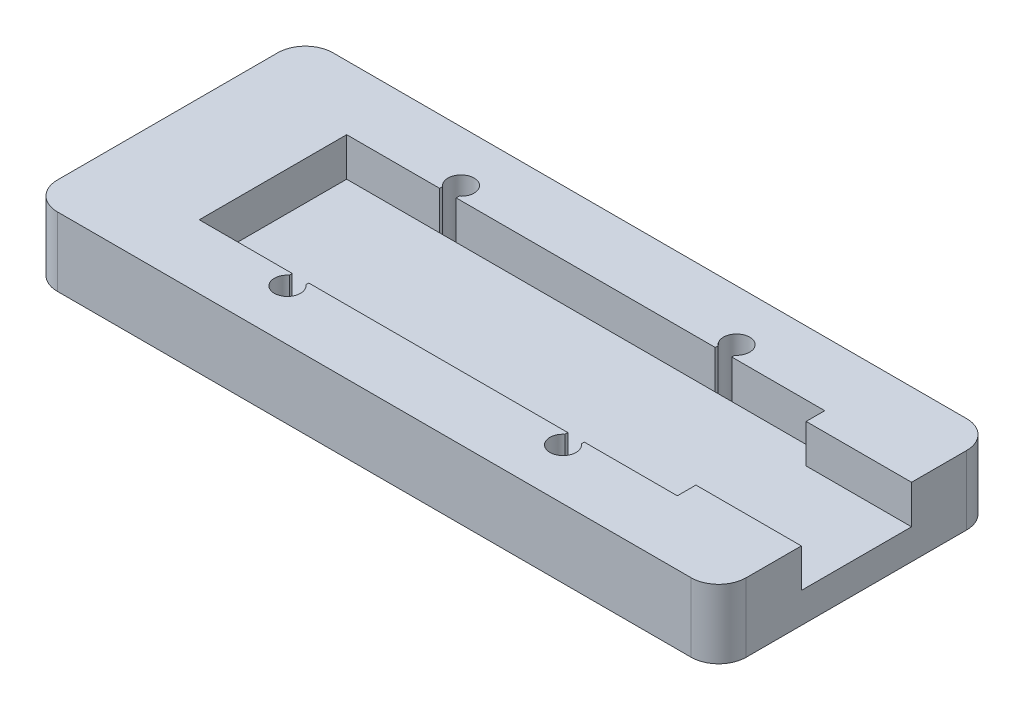
ISO-10303-21;
HEADER;
FILE_DESCRIPTION(('STEP AP214'),'2;1');
FILE_NAME('part.step','',(''),(''),'','','');
FILE_SCHEMA(('AUTOMOTIVE_DESIGN { 1 0 10303 214 1 1 1 1 }'));
ENDSEC;
DATA;
#1=APPLICATION_CONTEXT('core data for automotive mechanical design processes');
#2=APPLICATION_PROTOCOL_DEFINITION('international standard','automotive_design',2000,#1);
#3=PRODUCT_CONTEXT('',#1,'mechanical');
#4=PRODUCT('Part','Part','',(#3));
#5=PRODUCT_RELATED_PRODUCT_CATEGORY('part','',(#4));
#6=PRODUCT_DEFINITION_FORMATION('','',#4);
#7=PRODUCT_DEFINITION_CONTEXT('part definition',#1,'design');
#8=PRODUCT_DEFINITION('design','',#6,#7);
#9=PRODUCT_DEFINITION_SHAPE('','',#8);
#10=(LENGTH_UNIT() NAMED_UNIT(*) SI_UNIT(.MILLI.,.METRE.));
#11=(NAMED_UNIT(*) PLANE_ANGLE_UNIT() SI_UNIT($,.RADIAN.));
#12=(NAMED_UNIT(*) SI_UNIT($,.STERADIAN.) SOLID_ANGLE_UNIT());
#13=UNCERTAINTY_MEASURE_WITH_UNIT(LENGTH_MEASURE(1.E-05),#10,'distance_accuracy_value','');
#14=(GEOMETRIC_REPRESENTATION_CONTEXT(3) GLOBAL_UNCERTAINTY_ASSIGNED_CONTEXT((#13)) GLOBAL_UNIT_ASSIGNED_CONTEXT((#10,
#11,#12)) REPRESENTATION_CONTEXT('',''));
#15=CARTESIAN_POINT('',(0.,0.,0.));
#16=DIRECTION('',(0.,0.,1.));
#17=DIRECTION('',(1.,0.,0.));
#18=AXIS2_PLACEMENT_3D('',#15,#16,#17);
#19=CARTESIAN_POINT('',(-17.35,2.2,-5.35));
#20=DIRECTION('',(0.,0.,-1.));
#21=DIRECTION('',(-1.,0.,0.));
#22=AXIS2_PLACEMENT_3D('',#19,#20,#21);
#23=PLANE('',#22);
#24=DIRECTION('',(-1.,0.,0.));
#25=VECTOR('',#24,1.);
#26=CARTESIAN_POINT('',(-17.35,5.,-5.35));
#27=LINE('',#26,#25);
#28=CARTESIAN_POINT('',(17.35,5.,-5.35));
#29=VERTEX_POINT('',#28);
#30=CARTESIAN_POINT('',(10.6,5.,-5.35));
#31=VERTEX_POINT('',#30);
#32=EDGE_CURVE('E430',#29,#31,#27,.T.);
#33=ORIENTED_EDGE('',*,*,#32,.T.);
#34=DIRECTION('',(0.,1.,0.));
#35=VECTOR('',#34,1.);
#36=CARTESIAN_POINT('',(10.6,0.,-5.35));
#37=LINE('',#36,#35);
#38=CARTESIAN_POINT('',(10.6,2.2,-5.35));
#39=VERTEX_POINT('',#38);
#40=EDGE_CURVE('E331',#39,#31,#37,.T.);
#41=ORIENTED_EDGE('',*,*,#40,.F.);
#42=DIRECTION('',(-1.,0.,0.));
#43=VECTOR('',#42,1.);
#44=CARTESIAN_POINT('',(-17.35,2.2,-5.35));
#45=LINE('',#44,#43);
#46=CARTESIAN_POINT('',(17.35,2.2,-5.35));
#47=VERTEX_POINT('',#46);
#48=EDGE_CURVE('E402',#47,#39,#45,.T.);
#49=ORIENTED_EDGE('',*,*,#48,.F.);
#50=DIRECTION('',(0.,1.,0.));
#51=VECTOR('',#50,1.);
#52=CARTESIAN_POINT('',(17.35,2.2,-5.35));
#53=LINE('',#52,#51);
#54=EDGE_CURVE('E427',#47,#29,#53,.T.);
#55=ORIENTED_EDGE('',*,*,#54,.T.);
#56=EDGE_LOOP('',(#33,#41,#49,#55));
#57=FACE_BOUND('',#56,.T.);
#58=ADVANCED_FACE('F33',(#57),#23,.F.);
#59=CARTESIAN_POINT('',(-17.35,2.2,5.35));
#60=DIRECTION('',(0.,0.,1.));
#61=DIRECTION('',(1.,0.,0.));
#62=AXIS2_PLACEMENT_3D('',#59,#60,#61);
#63=PLANE('',#62);
#64=DIRECTION('',(1.,0.,0.));
#65=VECTOR('',#64,1.);
#66=CARTESIAN_POINT('',(-17.35,5.,5.35));
#67=LINE('',#66,#65);
#68=CARTESIAN_POINT('',(-17.35,5.,5.35));
#69=VERTEX_POINT('',#68);
#70=CARTESIAN_POINT('',(-10.6,5.,5.35));
#71=VERTEX_POINT('',#70);
#72=EDGE_CURVE('E438',#69,#71,#67,.T.);
#73=ORIENTED_EDGE('',*,*,#72,.T.);
#74=DIRECTION('',(0.,1.,0.));
#75=VECTOR('',#74,1.);
#76=CARTESIAN_POINT('',(-10.6,0.,5.35));
#77=LINE('',#76,#75);
#78=CARTESIAN_POINT('',(-10.6,2.2,5.35));
#79=VERTEX_POINT('',#78);
#80=EDGE_CURVE('E302',#79,#71,#77,.T.);
#81=ORIENTED_EDGE('',*,*,#80,.F.);
#82=DIRECTION('',(1.,0.,0.));
#83=VECTOR('',#82,1.);
#84=CARTESIAN_POINT('',(-17.35,2.2,5.35));
#85=LINE('',#84,#83);
#86=CARTESIAN_POINT('',(-17.35,2.2,5.35));
#87=VERTEX_POINT('',#86);
#88=EDGE_CURVE('E412',#87,#79,#85,.T.);
#89=ORIENTED_EDGE('',*,*,#88,.F.);
#90=DIRECTION('',(0.,1.,0.));
#91=VECTOR('',#90,1.);
#92=CARTESIAN_POINT('',(-17.35,2.2,5.35));
#93=LINE('',#92,#91);
#94=EDGE_CURVE('E462',#87,#69,#93,.T.);
#95=ORIENTED_EDGE('',*,*,#94,.T.);
#96=EDGE_LOOP('',(#73,#81,#89,#95));
#97=FACE_BOUND('',#96,.T.);
#98=ADVANCED_FACE('F572',(#97),#63,.F.);
#99=CARTESIAN_POINT('',(-9.4,2.2,5.35));
#100=VERTEX_POINT('',#99);
#101=CARTESIAN_POINT('',(9.4,2.2,5.35));
#102=VERTEX_POINT('',#101);
#103=EDGE_CURVE('E689',#100,#102,#85,.T.);
#104=ORIENTED_EDGE('',*,*,#103,.F.);
#105=DIRECTION('',(0.,1.,0.));
#106=VECTOR('',#105,1.);
#107=CARTESIAN_POINT('',(-9.4,0.,5.35));
#108=LINE('',#107,#106);
#109=CARTESIAN_POINT('',(-9.4,5.,5.35));
#110=VERTEX_POINT('',#109);
#111=EDGE_CURVE('E305',#100,#110,#108,.T.);
#112=ORIENTED_EDGE('',*,*,#111,.T.);
#113=CARTESIAN_POINT('',(9.4,5.,5.35));
#114=VERTEX_POINT('',#113);
#115=EDGE_CURVE('E442',#110,#114,#67,.T.);
#116=ORIENTED_EDGE('',*,*,#115,.T.);
#117=DIRECTION('',(0.,1.,0.));
#118=VECTOR('',#117,1.);
#119=CARTESIAN_POINT('',(9.4,0.,5.35));
#120=LINE('',#119,#118);
#121=EDGE_CURVE('E361',#102,#114,#120,.T.);
#122=ORIENTED_EDGE('',*,*,#121,.F.);
#123=EDGE_LOOP('',(#104,#112,#116,#122));
#124=FACE_BOUND('',#123,.T.);
#125=ADVANCED_FACE('F580',(#124),#63,.F.);
#126=CARTESIAN_POINT('',(9.4,2.2,-5.35));
#127=VERTEX_POINT('',#126);
#128=CARTESIAN_POINT('',(-9.4,2.2,-5.35));
#129=VERTEX_POINT('',#128);
#130=EDGE_CURVE('E407',#127,#129,#45,.T.);
#131=ORIENTED_EDGE('',*,*,#130,.F.);
#132=DIRECTION('',(0.,1.,0.));
#133=VECTOR('',#132,1.);
#134=CARTESIAN_POINT('',(9.4,0.,-5.35));
#135=LINE('',#134,#133);
#136=CARTESIAN_POINT('',(9.4,5.,-5.35));
#137=VERTEX_POINT('',#136);
#138=EDGE_CURVE('E334',#127,#137,#135,.T.);
#139=ORIENTED_EDGE('',*,*,#138,.T.);
#140=CARTESIAN_POINT('',(-9.4,5.,-5.35));
#141=VERTEX_POINT('',#140);
#142=EDGE_CURVE('E434',#137,#141,#27,.T.);
#143=ORIENTED_EDGE('',*,*,#142,.T.);
#144=DIRECTION('',(0.,1.,0.));
#145=VECTOR('',#144,1.);
#146=CARTESIAN_POINT('',(-9.4,0.,-5.35));
#147=LINE('',#146,#145);
#148=EDGE_CURVE('E392',#129,#141,#147,.T.);
#149=ORIENTED_EDGE('',*,*,#148,.F.);
#150=EDGE_LOOP('',(#131,#139,#143,#149));
#151=FACE_BOUND('',#150,.T.);
#152=ADVANCED_FACE('F575',(#151),#23,.F.);
#153=CARTESIAN_POINT('',(23.,5.,-8.));
#154=DIRECTION('',(0.,-1.,0.));
#155=DIRECTION('',(0.,0.,-1.));
#156=AXIS2_PLACEMENT_3D('',#153,#154,#155);
#157=CYLINDRICAL_SURFACE('',#156,2.);
#158=CARTESIAN_POINT('',(23.,0.,-8.));
#159=DIRECTION('',(0.,1.,0.));
#160=DIRECTION('',(0.,0.,-1.));
#161=AXIS2_PLACEMENT_3D('',#158,#159,#160);
#162=CIRCLE('',#161,2.);
#163=CARTESIAN_POINT('',(25.,0.,-7.99999999999999));
#164=VERTEX_POINT('',#163);
#165=CARTESIAN_POINT('',(23.,0.,-10.));
#166=VERTEX_POINT('',#165);
#167=EDGE_CURVE('E451',#164,#166,#162,.T.);
#168=ORIENTED_EDGE('',*,*,#167,.T.);
#169=DIRECTION('',(0.,-1.,0.));
#170=VECTOR('',#169,1.);
#171=CARTESIAN_POINT('',(23.,5.,-10.));
#172=LINE('',#171,#170);
#173=CARTESIAN_POINT('',(23.,5.,-10.));
#174=VERTEX_POINT('',#173);
#175=EDGE_CURVE('E11',#174,#166,#172,.T.);
#176=ORIENTED_EDGE('',*,*,#175,.F.);
#177=CARTESIAN_POINT('',(23.,5.,-8.));
#178=DIRECTION('',(0.,1.,0.));
#179=DIRECTION('',(0.,0.,-1.));
#180=AXIS2_PLACEMENT_3D('',#177,#178,#179);
#181=CIRCLE('',#180,2.);
#182=CARTESIAN_POINT('',(25.,5.,-7.99999999999999));
#183=VERTEX_POINT('',#182);
#184=EDGE_CURVE('E469',#183,#174,#181,.T.);
#185=ORIENTED_EDGE('',*,*,#184,.F.);
#186=DIRECTION('',(0.,-1.,0.));
#187=VECTOR('',#186,1.);
#188=CARTESIAN_POINT('',(25.,5.,-7.99999999999999));
#189=LINE('',#188,#187);
#190=EDGE_CURVE('E489',#183,#164,#189,.T.);
#191=ORIENTED_EDGE('',*,*,#190,.T.);
#192=EDGE_LOOP('',(#168,#176,#185,#191));
#193=FACE_BOUND('',#192,.T.);
#194=ADVANCED_FACE('F35',(#193),#157,.T.);
#195=CARTESIAN_POINT('',(-23.,5.,-10.));
#196=DIRECTION('',(0.,0.,1.));
#197=DIRECTION('',(1.,0.,0.));
#198=AXIS2_PLACEMENT_3D('',#195,#196,#197);
#199=PLANE('',#198);
#200=DIRECTION('',(-1.,0.,0.));
#201=VECTOR('',#200,1.);
#202=CARTESIAN_POINT('',(-23.,0.,-10.));
#203=LINE('',#202,#201);
#204=CARTESIAN_POINT('',(-23.,0.,-10.));
#205=VERTEX_POINT('',#204);
#206=EDGE_CURVE('E492',#166,#205,#203,.T.);
#207=ORIENTED_EDGE('',*,*,#206,.T.);
#208=DIRECTION('',(0.,-1.,0.));
#209=VECTOR('',#208,1.);
#210=CARTESIAN_POINT('',(-23.,5.,-10.));
#211=LINE('',#210,#209);
#212=CARTESIAN_POINT('',(-23.,5.,-10.));
#213=VERTEX_POINT('',#212);
#214=EDGE_CURVE('E41',#213,#205,#211,.T.);
#215=ORIENTED_EDGE('',*,*,#214,.F.);
#216=DIRECTION('',(-1.,0.,0.));
#217=VECTOR('',#216,1.);
#218=CARTESIAN_POINT('',(-23.,5.,-10.));
#219=LINE('',#218,#217);
#220=EDGE_CURVE('E472',#174,#213,#219,.T.);
#221=ORIENTED_EDGE('',*,*,#220,.F.);
#222=ORIENTED_EDGE('',*,*,#175,.T.);
#223=EDGE_LOOP('',(#207,#215,#221,#222));
#224=FACE_BOUND('',#223,.T.);
#225=ADVANCED_FACE('F548',(#224),#199,.F.);
#226=CARTESIAN_POINT('',(-23.,5.,-8.));
#227=DIRECTION('',(0.,-1.,0.));
#228=DIRECTION('',(0.,0.,-1.));
#229=AXIS2_PLACEMENT_3D('',#226,#227,#228);
#230=CYLINDRICAL_SURFACE('',#229,2.);
#231=CARTESIAN_POINT('',(-23.,0.,-8.));
#232=DIRECTION('',(0.,1.,0.));
#233=DIRECTION('',(0.,0.,-1.));
#234=AXIS2_PLACEMENT_3D('',#231,#232,#233);
#235=CIRCLE('',#234,2.);
#236=CARTESIAN_POINT('',(-25.,0.,-7.99999999999999));
#237=VERTEX_POINT('',#236);
#238=EDGE_CURVE('E494',#205,#237,#235,.T.);
#239=ORIENTED_EDGE('',*,*,#238,.T.);
#240=DIRECTION('',(0.,-1.,0.));
#241=VECTOR('',#240,1.);
#242=CARTESIAN_POINT('',(-25.,5.,-7.99999999999999));
#243=LINE('',#242,#241);
#244=CARTESIAN_POINT('',(-25.,5.,-7.99999999999999));
#245=VERTEX_POINT('',#244);
#246=EDGE_CURVE('E519',#245,#237,#243,.T.);
#247=ORIENTED_EDGE('',*,*,#246,.F.);
#248=CARTESIAN_POINT('',(-23.,5.,-8.));
#249=DIRECTION('',(0.,1.,0.));
#250=DIRECTION('',(0.,0.,-1.));
#251=AXIS2_PLACEMENT_3D('',#248,#249,#250);
#252=CIRCLE('',#251,2.);
#253=EDGE_CURVE('E475',#213,#245,#252,.T.);
#254=ORIENTED_EDGE('',*,*,#253,.F.);
#255=ORIENTED_EDGE('',*,*,#214,.T.);
#256=EDGE_LOOP('',(#239,#247,#254,#255));
#257=FACE_BOUND('',#256,.T.);
#258=ADVANCED_FACE('F526',(#257),#230,.T.);
#259=CARTESIAN_POINT('',(-25.,5.,7.99999999999999));
#260=DIRECTION('',(1.,0.,0.));
#261=DIRECTION('',(0.,0.,-1.));
#262=AXIS2_PLACEMENT_3D('',#259,#260,#261);
#263=PLANE('',#262);
#264=DIRECTION('',(0.,0.,1.));
#265=VECTOR('',#264,1.);
#266=CARTESIAN_POINT('',(-25.,0.,7.99999999999999));
#267=LINE('',#266,#265);
#268=CARTESIAN_POINT('',(-25.,0.,7.99999999999999));
#269=VERTEX_POINT('',#268);
#270=EDGE_CURVE('E496',#237,#269,#267,.T.);
#271=ORIENTED_EDGE('',*,*,#270,.T.);
#272=DIRECTION('',(0.,-1.,0.));
#273=VECTOR('',#272,1.);
#274=CARTESIAN_POINT('',(-25.,5.,7.99999999999999));
#275=LINE('',#274,#273);
#276=CARTESIAN_POINT('',(-25.,5.,7.99999999999999));
#277=VERTEX_POINT('',#276);
#278=EDGE_CURVE('E516',#277,#269,#275,.T.);
#279=ORIENTED_EDGE('',*,*,#278,.F.);
#280=DIRECTION('',(0.,0.,1.));
#281=VECTOR('',#280,1.);
#282=CARTESIAN_POINT('',(-25.,5.,7.99999999999999));
#283=LINE('',#282,#281);
#284=EDGE_CURVE('E477',#245,#277,#283,.T.);
#285=ORIENTED_EDGE('',*,*,#284,.F.);
#286=ORIENTED_EDGE('',*,*,#246,.T.);
#287=EDGE_LOOP('',(#271,#279,#285,#286));
#288=FACE_BOUND('',#287,.T.);
#289=ADVANCED_FACE('F536',(#288),#263,.F.);
#290=CARTESIAN_POINT('',(-23.,5.,8.));
#291=DIRECTION('',(0.,-1.,0.));
#292=DIRECTION('',(0.,0.,-1.));
#293=AXIS2_PLACEMENT_3D('',#290,#291,#292);
#294=CYLINDRICAL_SURFACE('',#293,2.);
#295=CARTESIAN_POINT('',(-23.,0.,8.));
#296=DIRECTION('',(0.,1.,0.));
#297=DIRECTION('',(0.,0.,-1.));
#298=AXIS2_PLACEMENT_3D('',#295,#296,#297);
#299=CIRCLE('',#298,2.);
#300=CARTESIAN_POINT('',(-23.,0.,10.));
#301=VERTEX_POINT('',#300);
#302=EDGE_CURVE('E498',#269,#301,#299,.T.);
#303=ORIENTED_EDGE('',*,*,#302,.T.);
#304=DIRECTION('',(0.,-1.,0.));
#305=VECTOR('',#304,1.);
#306=CARTESIAN_POINT('',(-23.,5.,10.));
#307=LINE('',#306,#305);
#308=CARTESIAN_POINT('',(-23.,5.,10.));
#309=VERTEX_POINT('',#308);
#310=EDGE_CURVE('E513',#309,#301,#307,.T.);
#311=ORIENTED_EDGE('',*,*,#310,.F.);
#312=CARTESIAN_POINT('',(-23.,5.,8.));
#313=DIRECTION('',(0.,1.,0.));
#314=DIRECTION('',(0.,0.,-1.));
#315=AXIS2_PLACEMENT_3D('',#312,#313,#314);
#316=CIRCLE('',#315,2.);
#317=EDGE_CURVE('E479',#277,#309,#316,.T.);
#318=ORIENTED_EDGE('',*,*,#317,.F.);
#319=ORIENTED_EDGE('',*,*,#278,.T.);
#320=EDGE_LOOP('',(#303,#311,#318,#319));
#321=FACE_BOUND('',#320,.T.);
#322=ADVANCED_FACE('F540',(#321),#294,.T.);
#323=CARTESIAN_POINT('',(-23.,5.,10.));
#324=DIRECTION('',(0.,0.,-1.));
#325=DIRECTION('',(-1.,0.,0.));
#326=AXIS2_PLACEMENT_3D('',#323,#324,#325);
#327=PLANE('',#326);
#328=DIRECTION('',(1.,0.,0.));
#329=VECTOR('',#328,1.);
#330=CARTESIAN_POINT('',(-23.,0.,10.));
#331=LINE('',#330,#329);
#332=CARTESIAN_POINT('',(23.,0.,10.));
#333=VERTEX_POINT('',#332);
#334=EDGE_CURVE('E500',#301,#333,#331,.T.);
#335=ORIENTED_EDGE('',*,*,#334,.T.);
#336=DIRECTION('',(0.,-1.,0.));
#337=VECTOR('',#336,1.);
#338=CARTESIAN_POINT('',(23.,5.,10.));
#339=LINE('',#338,#337);
#340=CARTESIAN_POINT('',(23.,5.,10.));
#341=VERTEX_POINT('',#340);
#342=EDGE_CURVE('E510',#341,#333,#339,.T.);
#343=ORIENTED_EDGE('',*,*,#342,.F.);
#344=DIRECTION('',(1.,0.,0.));
#345=VECTOR('',#344,1.);
#346=CARTESIAN_POINT('',(-23.,5.,10.));
#347=LINE('',#346,#345);
#348=EDGE_CURVE('E481',#309,#341,#347,.T.);
#349=ORIENTED_EDGE('',*,*,#348,.F.);
#350=ORIENTED_EDGE('',*,*,#310,.T.);
#351=EDGE_LOOP('',(#335,#343,#349,#350));
#352=FACE_BOUND('',#351,.T.);
#353=ADVANCED_FACE('F562',(#352),#327,.F.);
#354=CARTESIAN_POINT('',(23.,5.,8.));
#355=DIRECTION('',(0.,-1.,0.));
#356=DIRECTION('',(0.,0.,-1.));
#357=AXIS2_PLACEMENT_3D('',#354,#355,#356);
#358=CYLINDRICAL_SURFACE('',#357,2.);
#359=CARTESIAN_POINT('',(23.,0.,8.));
#360=DIRECTION('',(0.,1.,0.));
#361=DIRECTION('',(0.,0.,-1.));
#362=AXIS2_PLACEMENT_3D('',#359,#360,#361);
#363=CIRCLE('',#362,2.);
#364=CARTESIAN_POINT('',(25.,0.,7.99999999999999));
#365=VERTEX_POINT('',#364);
#366=EDGE_CURVE('E502',#333,#365,#363,.T.);
#367=ORIENTED_EDGE('',*,*,#366,.T.);
#368=DIRECTION('',(0.,-1.,0.));
#369=VECTOR('',#368,1.);
#370=CARTESIAN_POINT('',(25.,5.,7.99999999999999));
#371=LINE('',#370,#369);
#372=CARTESIAN_POINT('',(25.,5.,7.99999999999999));
#373=VERTEX_POINT('',#372);
#374=EDGE_CURVE('E507',#373,#365,#371,.T.);
#375=ORIENTED_EDGE('',*,*,#374,.F.);
#376=CARTESIAN_POINT('',(23.,5.,8.));
#377=DIRECTION('',(0.,1.,0.));
#378=DIRECTION('',(0.,0.,-1.));
#379=AXIS2_PLACEMENT_3D('',#376,#377,#378);
#380=CIRCLE('',#379,2.);
#381=EDGE_CURVE('E483',#341,#373,#380,.T.);
#382=ORIENTED_EDGE('',*,*,#381,.F.);
#383=ORIENTED_EDGE('',*,*,#342,.T.);
#384=EDGE_LOOP('',(#367,#375,#382,#383));
#385=FACE_BOUND('',#384,.T.);
#386=ADVANCED_FACE('F560',(#385),#358,.T.);
#387=CARTESIAN_POINT('',(25.,5.,7.99999999999999));
#388=DIRECTION('',(-1.,0.,0.));
#389=DIRECTION('',(0.,0.,1.));
#390=AXIS2_PLACEMENT_3D('',#387,#388,#389);
#391=PLANE('',#390);
#392=DIRECTION('',(0.,0.,-1.));
#393=VECTOR('',#392,1.);
#394=CARTESIAN_POINT('',(25.,5.,7.99999999999999));
#395=LINE('',#394,#393);
#396=CARTESIAN_POINT('',(25.,5.,-4.));
#397=VERTEX_POINT('',#396);
#398=EDGE_CURVE('E485',#397,#183,#395,.T.);
#399=ORIENTED_EDGE('',*,*,#398,.F.);
#400=DIRECTION('',(0.,1.,0.));
#401=VECTOR('',#400,1.);
#402=CARTESIAN_POINT('',(25.,2.2,-4.));
#403=LINE('',#402,#401);
#404=CARTESIAN_POINT('',(25.,2.2,-4.));
#405=VERTEX_POINT('',#404);
#406=EDGE_CURVE('E452',#405,#397,#403,.T.);
#407=ORIENTED_EDGE('',*,*,#406,.F.);
#408=DIRECTION('',(0.,0.,-1.));
#409=VECTOR('',#408,1.);
#410=CARTESIAN_POINT('',(25.,2.2,4.));
#411=LINE('',#410,#409);
#412=CARTESIAN_POINT('',(25.,2.2,4.));
#413=VERTEX_POINT('',#412);
#414=EDGE_CURVE('E422',#413,#405,#411,.T.);
#415=ORIENTED_EDGE('',*,*,#414,.F.);
#416=DIRECTION('',(0.,1.,0.));
#417=VECTOR('',#416,1.);
#418=CARTESIAN_POINT('',(25.,2.2,4.));
#419=LINE('',#418,#417);
#420=CARTESIAN_POINT('',(25.,5.,4.));
#421=VERTEX_POINT('',#420);
#422=EDGE_CURVE('E454',#413,#421,#419,.T.);
#423=ORIENTED_EDGE('',*,*,#422,.T.);
#424=EDGE_CURVE('E486',#373,#421,#395,.T.);
#425=ORIENTED_EDGE('',*,*,#424,.F.);
#426=ORIENTED_EDGE('',*,*,#374,.T.);
#427=DIRECTION('',(0.,0.,-1.));
#428=VECTOR('',#427,1.);
#429=CARTESIAN_POINT('',(25.,0.,7.99999999999999));
#430=LINE('',#429,#428);
#431=EDGE_CURVE('E473',#365,#164,#430,.T.);
#432=ORIENTED_EDGE('',*,*,#431,.T.);
#433=ORIENTED_EDGE('',*,*,#190,.F.);
#434=EDGE_LOOP('',(#399,#407,#415,#423,#425,#426,#432,#433));
#435=FACE_BOUND('',#434,.T.);
#436=ADVANCED_FACE('F555',(#435),#391,.F.);
#437=CARTESIAN_POINT('',(23.,5.,-8.));
#438=DIRECTION('',(0.,-1.,0.));
#439=DIRECTION('',(0.,0.,-1.));
#440=AXIS2_PLACEMENT_3D('',#437,#438,#439);
#441=PLANE('',#440);
#442=CARTESIAN_POINT('',(-10.,5.,6.3));
#443=DIRECTION('',(0.,1.,0.));
#444=DIRECTION('',(0.,0.,-1.));
#445=AXIS2_PLACEMENT_3D('',#442,#443,#444);
#446=CIRCLE('',#445,0.949999999999999);
#447=CARTESIAN_POINT('',(-10.6,5.,5.56345400686719));
#448=VERTEX_POINT('',#447);
#449=CARTESIAN_POINT('',(-9.4,5.,5.56345400686719));
#450=VERTEX_POINT('',#449);
#451=EDGE_CURVE('E291',#448,#450,#446,.T.);
#452=ORIENTED_EDGE('',*,*,#451,.F.);
#453=DIRECTION('',(0.,0.,1.));
#454=VECTOR('',#453,1.);
#455=CARTESIAN_POINT('',(-10.6,5.,5.56345400686719));
#456=LINE('',#455,#454);
#457=EDGE_CURVE('E274',#71,#448,#456,.T.);
#458=ORIENTED_EDGE('',*,*,#457,.F.);
#459=ORIENTED_EDGE('',*,*,#72,.F.);
#460=DIRECTION('',(0.,0.,1.));
#461=VECTOR('',#460,1.);
#462=CARTESIAN_POINT('',(-17.35,5.,5.35));
#463=LINE('',#462,#461);
#464=CARTESIAN_POINT('',(-17.35,5.,-5.35));
#465=VERTEX_POINT('',#464);
#466=EDGE_CURVE('E433',#465,#69,#463,.T.);
#467=ORIENTED_EDGE('',*,*,#466,.F.);
#468=CARTESIAN_POINT('',(-10.6,5.,-5.35));
#469=VERTEX_POINT('',#468);
#470=EDGE_CURVE('E429',#469,#465,#27,.T.);
#471=ORIENTED_EDGE('',*,*,#470,.F.);
#472=DIRECTION('',(0.,0.,1.));
#473=VECTOR('',#472,1.);
#474=CARTESIAN_POINT('',(-10.6,5.,-5.56345400686719));
#475=LINE('',#474,#473);
#476=CARTESIAN_POINT('',(-10.6,5.,-5.56345400686719));
#477=VERTEX_POINT('',#476);
#478=EDGE_CURVE('E382',#477,#469,#475,.T.);
#479=ORIENTED_EDGE('',*,*,#478,.F.);
#480=CARTESIAN_POINT('',(-10.,5.,-6.3));
#481=DIRECTION('',(0.,1.,0.));
#482=DIRECTION('',(0.,0.,1.));
#483=AXIS2_PLACEMENT_3D('',#480,#481,#482);
#484=CIRCLE('',#483,0.949999999999999);
#485=CARTESIAN_POINT('',(-9.4,5.,-5.56345400686719));
#486=VERTEX_POINT('',#485);
#487=EDGE_CURVE('E301',#486,#477,#484,.T.);
#488=ORIENTED_EDGE('',*,*,#487,.F.);
#489=DIRECTION('',(0.,0.,-1.));
#490=VECTOR('',#489,1.);
#491=CARTESIAN_POINT('',(-9.4,5.,-5.56345400686719));
#492=LINE('',#491,#490);
#493=EDGE_CURVE('E370',#141,#486,#492,.T.);
#494=ORIENTED_EDGE('',*,*,#493,.F.);
#495=ORIENTED_EDGE('',*,*,#142,.F.);
#496=DIRECTION('',(0.,0.,1.));
#497=VECTOR('',#496,1.);
#498=CARTESIAN_POINT('',(9.4,5.,-5.56345400686718));
#499=LINE('',#498,#497);
#500=CARTESIAN_POINT('',(9.4,5.,-5.56345400686718));
#501=VERTEX_POINT('',#500);
#502=EDGE_CURVE('E322',#501,#137,#499,.T.);
#503=ORIENTED_EDGE('',*,*,#502,.F.);
#504=CARTESIAN_POINT('',(10.,5.,-6.3));
#505=DIRECTION('',(0.,1.,0.));
#506=DIRECTION('',(0.,0.,-1.));
#507=AXIS2_PLACEMENT_3D('',#504,#505,#506);
#508=CIRCLE('',#507,0.949999999999999);
#509=CARTESIAN_POINT('',(10.6,5.,-5.56345400686718));
#510=VERTEX_POINT('',#509);
#511=EDGE_CURVE('E319',#510,#501,#508,.T.);
#512=ORIENTED_EDGE('',*,*,#511,.F.);
#513=DIRECTION('',(0.,0.,-1.));
#514=VECTOR('',#513,1.);
#515=CARTESIAN_POINT('',(10.6,5.,-5.56345400686718));
#516=LINE('',#515,#514);
#517=EDGE_CURVE('E311',#31,#510,#516,.T.);
#518=ORIENTED_EDGE('',*,*,#517,.F.);
#519=ORIENTED_EDGE('',*,*,#32,.F.);
#520=DIRECTION('',(0.,0.,-1.));
#521=VECTOR('',#520,1.);
#522=CARTESIAN_POINT('',(17.35,5.,-4.));
#523=LINE('',#522,#521);
#524=CARTESIAN_POINT('',(17.35,5.,-4.));
#525=VERTEX_POINT('',#524);
#526=EDGE_CURVE('E388',#525,#29,#523,.T.);
#527=ORIENTED_EDGE('',*,*,#526,.F.);
#528=DIRECTION('',(-1.,0.,0.));
#529=VECTOR('',#528,1.);
#530=CARTESIAN_POINT('',(17.35,5.,-4.));
#531=LINE('',#530,#529);
#532=EDGE_CURVE('E401',#397,#525,#531,.T.);
#533=ORIENTED_EDGE('',*,*,#532,.F.);
#534=ORIENTED_EDGE('',*,*,#398,.T.);
#535=ORIENTED_EDGE('',*,*,#184,.T.);
#536=ORIENTED_EDGE('',*,*,#220,.T.);
#537=ORIENTED_EDGE('',*,*,#253,.T.);
#538=ORIENTED_EDGE('',*,*,#284,.T.);
#539=ORIENTED_EDGE('',*,*,#317,.T.);
#540=ORIENTED_EDGE('',*,*,#348,.T.);
#541=ORIENTED_EDGE('',*,*,#381,.T.);
#542=ORIENTED_EDGE('',*,*,#424,.T.);
#543=DIRECTION('',(1.,0.,0.));
#544=VECTOR('',#543,1.);
#545=CARTESIAN_POINT('',(17.35,5.,4.));
#546=LINE('',#545,#544);
#547=CARTESIAN_POINT('',(17.35,5.,4.));
#548=VERTEX_POINT('',#547);
#549=EDGE_CURVE('E445',#548,#421,#546,.T.);
#550=ORIENTED_EDGE('',*,*,#549,.F.);
#551=DIRECTION('',(0.,0.,-1.));
#552=VECTOR('',#551,1.);
#553=CARTESIAN_POINT('',(17.35,5.,5.35));
#554=LINE('',#553,#552);
#555=CARTESIAN_POINT('',(17.35,5.,5.35));
#556=VERTEX_POINT('',#555);
#557=EDGE_CURVE('E441',#556,#548,#554,.T.);
#558=ORIENTED_EDGE('',*,*,#557,.F.);
#559=CARTESIAN_POINT('',(10.6,5.,5.35));
#560=VERTEX_POINT('',#559);
#561=EDGE_CURVE('E437',#560,#556,#67,.T.);
#562=ORIENTED_EDGE('',*,*,#561,.F.);
#563=DIRECTION('',(0.,0.,-1.));
#564=VECTOR('',#563,1.);
#565=CARTESIAN_POINT('',(10.6,5.,5.56345400686718));
#566=LINE('',#565,#564);
#567=CARTESIAN_POINT('',(10.6,5.,5.56345400686718));
#568=VERTEX_POINT('',#567);
#569=EDGE_CURVE('E353',#568,#560,#566,.T.);
#570=ORIENTED_EDGE('',*,*,#569,.F.);
#571=CARTESIAN_POINT('',(10.,5.,6.3));
#572=DIRECTION('',(0.,1.,0.));
#573=DIRECTION('',(0.,0.,1.));
#574=AXIS2_PLACEMENT_3D('',#571,#572,#573);
#575=CIRCLE('',#574,0.949999999999999);
#576=CARTESIAN_POINT('',(9.4,5.,5.56345400686718));
#577=VERTEX_POINT('',#576);
#578=EDGE_CURVE('E350',#577,#568,#575,.T.);
#579=ORIENTED_EDGE('',*,*,#578,.F.);
#580=DIRECTION('',(0.,0.,1.));
#581=VECTOR('',#580,1.);
#582=CARTESIAN_POINT('',(9.4,5.,5.56345400686718));
#583=LINE('',#582,#581);
#584=EDGE_CURVE('E340',#114,#577,#583,.T.);
#585=ORIENTED_EDGE('',*,*,#584,.F.);
#586=ORIENTED_EDGE('',*,*,#115,.F.);
#587=DIRECTION('',(0.,0.,-1.));
#588=VECTOR('',#587,1.);
#589=CARTESIAN_POINT('',(-9.4,5.,5.56345400686719));
#590=LINE('',#589,#588);
#591=EDGE_CURVE('E289',#450,#110,#590,.T.);
#592=ORIENTED_EDGE('',*,*,#591,.F.);
#593=EDGE_LOOP('',(#452,#458,#459,#467,#471,#479,#488,#494,#495,#503,#512,#518,#519,#527,#533,
#534,#535,#536,#537,#538,#539,#540,#541,#542,#550,#558,#562,#570,#579,#585,#586,#592));
#594=FACE_BOUND('',#593,.T.);
#595=ADVANCED_FACE('F544',(#594),#441,.F.);
#596=CARTESIAN_POINT('',(23.,0.,-8.));
#597=DIRECTION('',(0.,-1.,0.));
#598=DIRECTION('',(0.,0.,-1.));
#599=AXIS2_PLACEMENT_3D('',#596,#597,#598);
#600=PLANE('',#599);
#601=DIRECTION('',(0.,0.,1.));
#602=VECTOR('',#601,1.);
#603=CARTESIAN_POINT('',(-10.6,0.,5.56345400686719));
#604=LINE('',#603,#602);
#605=CARTESIAN_POINT('',(-10.6,0.,5.35));
#606=VERTEX_POINT('',#605);
#607=CARTESIAN_POINT('',(-10.6,0.,5.56345400686719));
#608=VERTEX_POINT('',#607);
#609=EDGE_CURVE('E271',#606,#608,#604,.T.);
#610=ORIENTED_EDGE('',*,*,#609,.T.);
#611=CARTESIAN_POINT('',(-10.,0.,6.3));
#612=DIRECTION('',(0.,1.,0.));
#613=DIRECTION('',(0.,0.,-1.));
#614=AXIS2_PLACEMENT_3D('',#611,#612,#613);
#615=CIRCLE('',#614,0.949999999999999);
#616=CARTESIAN_POINT('',(-9.4,0.,5.56345400686719));
#617=VERTEX_POINT('',#616);
#618=EDGE_CURVE('E282',#608,#617,#615,.T.);
#619=ORIENTED_EDGE('',*,*,#618,.T.);
#620=DIRECTION('',(0.,0.,-1.));
#621=VECTOR('',#620,1.);
#622=CARTESIAN_POINT('',(-9.4,0.,5.56345400686719));
#623=LINE('',#622,#621);
#624=CARTESIAN_POINT('',(-9.4,0.,5.35));
#625=VERTEX_POINT('',#624);
#626=EDGE_CURVE('E48',#617,#625,#623,.T.);
#627=ORIENTED_EDGE('',*,*,#626,.T.);
#628=DIRECTION('',(-1.,0.,0.));
#629=VECTOR('',#628,1.);
#630=CARTESIAN_POINT('',(-10.6,0.,5.35));
#631=LINE('',#630,#629);
#632=EDGE_CURVE('E279',#625,#606,#631,.T.);
#633=ORIENTED_EDGE('',*,*,#632,.T.);
#634=EDGE_LOOP('',(#610,#619,#627,#633));
#635=FACE_BOUND('',#634,.T.);
#636=CARTESIAN_POINT('',(10.,0.,-6.3));
#637=DIRECTION('',(0.,1.,0.));
#638=DIRECTION('',(0.,0.,-1.));
#639=AXIS2_PLACEMENT_3D('',#636,#637,#638);
#640=CIRCLE('',#639,0.949999999999999);
#641=CARTESIAN_POINT('',(10.6,0.,-5.56345400686718));
#642=VERTEX_POINT('',#641);
#643=CARTESIAN_POINT('',(9.4,0.,-5.56345400686718));
#644=VERTEX_POINT('',#643);
#645=EDGE_CURVE('E307',#642,#644,#640,.T.);
#646=ORIENTED_EDGE('',*,*,#645,.T.);
#647=DIRECTION('',(0.,0.,1.));
#648=VECTOR('',#647,1.);
#649=CARTESIAN_POINT('',(9.4,0.,-5.56345400686718));
#650=LINE('',#649,#648);
#651=CARTESIAN_POINT('',(9.4,0.,-5.35));
#652=VERTEX_POINT('',#651);
#653=EDGE_CURVE('E310',#644,#652,#650,.T.);
#654=ORIENTED_EDGE('',*,*,#653,.T.);
#655=DIRECTION('',(1.,0.,0.));
#656=VECTOR('',#655,1.);
#657=CARTESIAN_POINT('',(9.4,0.,-5.35));
#658=LINE('',#657,#656);
#659=CARTESIAN_POINT('',(10.6,0.,-5.35));
#660=VERTEX_POINT('',#659);
#661=EDGE_CURVE('E56',#652,#660,#658,.T.);
#662=ORIENTED_EDGE('',*,*,#661,.T.);
#663=DIRECTION('',(0.,0.,-1.));
#664=VECTOR('',#663,1.);
#665=CARTESIAN_POINT('',(10.6,0.,-5.56345400686718));
#666=LINE('',#665,#664);
#667=EDGE_CURVE('E315',#660,#642,#666,.T.);
#668=ORIENTED_EDGE('',*,*,#667,.T.);
#669=EDGE_LOOP('',(#646,#654,#662,#668));
#670=FACE_BOUND('',#669,.T.);
#671=CARTESIAN_POINT('',(10.,0.,6.3));
#672=DIRECTION('',(0.,1.,0.));
#673=DIRECTION('',(0.,0.,1.));
#674=AXIS2_PLACEMENT_3D('',#671,#672,#673);
#675=CIRCLE('',#674,0.949999999999999);
#676=CARTESIAN_POINT('',(9.4,0.,5.56345400686718));
#677=VERTEX_POINT('',#676);
#678=CARTESIAN_POINT('',(10.6,0.,5.56345400686718));
#679=VERTEX_POINT('',#678);
#680=EDGE_CURVE('E336',#677,#679,#675,.T.);
#681=ORIENTED_EDGE('',*,*,#680,.T.);
#682=DIRECTION('',(0.,0.,-1.));
#683=VECTOR('',#682,1.);
#684=CARTESIAN_POINT('',(10.6,0.,5.56345400686718));
#685=LINE('',#684,#683);
#686=CARTESIAN_POINT('',(10.6,0.,5.35));
#687=VERTEX_POINT('',#686);
#688=EDGE_CURVE('E339',#679,#687,#685,.T.);
#689=ORIENTED_EDGE('',*,*,#688,.T.);
#690=DIRECTION('',(-1.,0.,0.));
#691=VECTOR('',#690,1.);
#692=CARTESIAN_POINT('',(10.6,0.,5.35));
#693=LINE('',#692,#691);
#694=CARTESIAN_POINT('',(9.4,0.,5.35));
#695=VERTEX_POINT('',#694);
#696=EDGE_CURVE('E343',#687,#695,#693,.T.);
#697=ORIENTED_EDGE('',*,*,#696,.T.);
#698=DIRECTION('',(0.,0.,1.));
#699=VECTOR('',#698,1.);
#700=CARTESIAN_POINT('',(9.4,0.,5.56345400686718));
#701=LINE('',#700,#699);
#702=EDGE_CURVE('E346',#695,#677,#701,.T.);
#703=ORIENTED_EDGE('',*,*,#702,.T.);
#704=EDGE_LOOP('',(#681,#689,#697,#703));
#705=FACE_BOUND('',#704,.T.);
#706=CARTESIAN_POINT('',(-10.,0.,-6.3));
#707=DIRECTION('',(0.,1.,0.));
#708=DIRECTION('',(0.,0.,1.));
#709=AXIS2_PLACEMENT_3D('',#706,#707,#708);
#710=CIRCLE('',#709,0.949999999999999);
#711=CARTESIAN_POINT('',(-9.4,0.,-5.56345400686719));
#712=VERTEX_POINT('',#711);
#713=CARTESIAN_POINT('',(-10.6,0.,-5.56345400686719));
#714=VERTEX_POINT('',#713);
#715=EDGE_CURVE('E366',#712,#714,#710,.T.);
#716=ORIENTED_EDGE('',*,*,#715,.T.);
#717=DIRECTION('',(0.,0.,1.));
#718=VECTOR('',#717,1.);
#719=CARTESIAN_POINT('',(-10.6,0.,-5.56345400686719));
#720=LINE('',#719,#718);
#721=CARTESIAN_POINT('',(-10.6,0.,-5.35));
#722=VERTEX_POINT('',#721);
#723=EDGE_CURVE('E369',#714,#722,#720,.T.);
#724=ORIENTED_EDGE('',*,*,#723,.T.);
#725=DIRECTION('',(1.,0.,0.));
#726=VECTOR('',#725,1.);
#727=CARTESIAN_POINT('',(-10.6,0.,-5.35));
#728=LINE('',#727,#726);
#729=CARTESIAN_POINT('',(-9.4,0.,-5.35));
#730=VERTEX_POINT('',#729);
#731=EDGE_CURVE('E373',#722,#730,#728,.T.);
#732=ORIENTED_EDGE('',*,*,#731,.T.);
#733=DIRECTION('',(0.,0.,-1.));
#734=VECTOR('',#733,1.);
#735=CARTESIAN_POINT('',(-9.4,0.,-5.56345400686719));
#736=LINE('',#735,#734);
#737=EDGE_CURVE('E376',#730,#712,#736,.T.);
#738=ORIENTED_EDGE('',*,*,#737,.T.);
#739=EDGE_LOOP('',(#716,#724,#732,#738));
#740=FACE_BOUND('',#739,.T.);
#741=ORIENTED_EDGE('',*,*,#167,.F.);
#742=ORIENTED_EDGE('',*,*,#431,.F.);
#743=ORIENTED_EDGE('',*,*,#366,.F.);
#744=ORIENTED_EDGE('',*,*,#334,.F.);
#745=ORIENTED_EDGE('',*,*,#302,.F.);
#746=ORIENTED_EDGE('',*,*,#270,.F.);
#747=ORIENTED_EDGE('',*,*,#238,.F.);
#748=ORIENTED_EDGE('',*,*,#206,.F.);
#749=EDGE_LOOP('',(#741,#742,#743,#744,#745,#746,#747,#748));
#750=FACE_BOUND('',#749,.T.);
#751=ADVANCED_FACE('F286',(#635,#670,#705,#740,#750),#600,.T.);
#752=CARTESIAN_POINT('',(17.35,2.2,-4.));
#753=DIRECTION('',(1.,0.,0.));
#754=DIRECTION('',(0.,0.,-1.));
#755=AXIS2_PLACEMENT_3D('',#752,#753,#754);
#756=PLANE('',#755);
#757=ORIENTED_EDGE('',*,*,#526,.T.);
#758=ORIENTED_EDGE('',*,*,#54,.F.);
#759=DIRECTION('',(0.,0.,-1.));
#760=VECTOR('',#759,1.);
#761=CARTESIAN_POINT('',(17.35,2.2,-4.));
#762=LINE('',#761,#760);
#763=CARTESIAN_POINT('',(17.35,2.2,-4.));
#764=VERTEX_POINT('',#763);
#765=EDGE_CURVE('E397',#764,#47,#762,.T.);
#766=ORIENTED_EDGE('',*,*,#765,.F.);
#767=DIRECTION('',(0.,1.,0.));
#768=VECTOR('',#767,1.);
#769=CARTESIAN_POINT('',(17.35,2.2,-4.));
#770=LINE('',#769,#768);
#771=EDGE_CURVE('E449',#764,#525,#770,.T.);
#772=ORIENTED_EDGE('',*,*,#771,.T.);
#773=EDGE_LOOP('',(#757,#758,#766,#772));
#774=FACE_BOUND('',#773,.T.);
#775=ADVANCED_FACE('F668',(#774),#756,.F.);
#776=CARTESIAN_POINT('',(17.35,2.2,-4.));
#777=DIRECTION('',(0.,0.,-1.));
#778=DIRECTION('',(-1.,0.,0.));
#779=AXIS2_PLACEMENT_3D('',#776,#777,#778);
#780=PLANE('',#779);
#781=ORIENTED_EDGE('',*,*,#532,.T.);
#782=ORIENTED_EDGE('',*,*,#771,.F.);
#783=DIRECTION('',(-1.,0.,0.));
#784=VECTOR('',#783,1.);
#785=CARTESIAN_POINT('',(17.35,2.2,-4.));
#786=LINE('',#785,#784);
#787=EDGE_CURVE('E424',#405,#764,#786,.T.);
#788=ORIENTED_EDGE('',*,*,#787,.F.);
#789=ORIENTED_EDGE('',*,*,#406,.T.);
#790=EDGE_LOOP('',(#781,#782,#788,#789));
#791=FACE_BOUND('',#790,.T.);
#792=ADVANCED_FACE('F664',(#791),#780,.F.);
#793=CARTESIAN_POINT('',(17.35,2.2,4.));
#794=DIRECTION('',(0.,0.,1.));
#795=DIRECTION('',(1.,0.,0.));
#796=AXIS2_PLACEMENT_3D('',#793,#794,#795);
#797=PLANE('',#796);
#798=ORIENTED_EDGE('',*,*,#549,.T.);
#799=ORIENTED_EDGE('',*,*,#422,.F.);
#800=DIRECTION('',(1.,0.,0.));
#801=VECTOR('',#800,1.);
#802=CARTESIAN_POINT('',(17.35,2.2,4.));
#803=LINE('',#802,#801);
#804=CARTESIAN_POINT('',(17.35,2.2,4.));
#805=VERTEX_POINT('',#804);
#806=EDGE_CURVE('E419',#805,#413,#803,.T.);
#807=ORIENTED_EDGE('',*,*,#806,.F.);
#808=DIRECTION('',(0.,1.,0.));
#809=VECTOR('',#808,1.);
#810=CARTESIAN_POINT('',(17.35,2.2,4.));
#811=LINE('',#810,#809);
#812=EDGE_CURVE('E457',#805,#548,#811,.T.);
#813=ORIENTED_EDGE('',*,*,#812,.T.);
#814=EDGE_LOOP('',(#798,#799,#807,#813));
#815=FACE_BOUND('',#814,.T.);
#816=ADVANCED_FACE('F667',(#815),#797,.F.);
#817=CARTESIAN_POINT('',(17.35,2.2,5.35));
#818=DIRECTION('',(1.,0.,0.));
#819=DIRECTION('',(0.,0.,-1.));
#820=AXIS2_PLACEMENT_3D('',#817,#818,#819);
#821=PLANE('',#820);
#822=ORIENTED_EDGE('',*,*,#557,.T.);
#823=ORIENTED_EDGE('',*,*,#812,.F.);
#824=DIRECTION('',(0.,0.,-1.));
#825=VECTOR('',#824,1.);
#826=CARTESIAN_POINT('',(17.35,2.2,5.35));
#827=LINE('',#826,#825);
#828=CARTESIAN_POINT('',(17.35,2.2,5.35));
#829=VERTEX_POINT('',#828);
#830=EDGE_CURVE('E415',#829,#805,#827,.T.);
#831=ORIENTED_EDGE('',*,*,#830,.F.);
#832=DIRECTION('',(0.,1.,0.));
#833=VECTOR('',#832,1.);
#834=CARTESIAN_POINT('',(17.35,2.2,5.35));
#835=LINE('',#834,#833);
#836=EDGE_CURVE('E459',#829,#556,#835,.T.);
#837=ORIENTED_EDGE('',*,*,#836,.T.);
#838=EDGE_LOOP('',(#822,#823,#831,#837));
#839=FACE_BOUND('',#838,.T.);
#840=ADVANCED_FACE('F672',(#839),#821,.F.);
#841=CARTESIAN_POINT('',(10.6,2.2,5.35));
#842=VERTEX_POINT('',#841);
#843=EDGE_CURVE('E411',#842,#829,#85,.T.);
#844=ORIENTED_EDGE('',*,*,#843,.F.);
#845=DIRECTION('',(0.,1.,0.));
#846=VECTOR('',#845,1.);
#847=CARTESIAN_POINT('',(10.6,0.,5.35));
#848=LINE('',#847,#846);
#849=EDGE_CURVE('E364',#842,#560,#848,.T.);
#850=ORIENTED_EDGE('',*,*,#849,.T.);
#851=ORIENTED_EDGE('',*,*,#561,.T.);
#852=ORIENTED_EDGE('',*,*,#836,.F.);
#853=EDGE_LOOP('',(#844,#850,#851,#852));
#854=FACE_BOUND('',#853,.T.);
#855=ADVANCED_FACE('F583',(#854),#63,.F.);
#856=CARTESIAN_POINT('',(-17.35,2.2,5.35));
#857=DIRECTION('',(-1.,0.,0.));
#858=DIRECTION('',(0.,0.,1.));
#859=AXIS2_PLACEMENT_3D('',#856,#857,#858);
#860=PLANE('',#859);
#861=ORIENTED_EDGE('',*,*,#466,.T.);
#862=ORIENTED_EDGE('',*,*,#94,.F.);
#863=DIRECTION('',(0.,0.,1.));
#864=VECTOR('',#863,1.);
#865=CARTESIAN_POINT('',(-17.35,2.2,5.35));
#866=LINE('',#865,#864);
#867=CARTESIAN_POINT('',(-17.35,2.2,-5.35));
#868=VERTEX_POINT('',#867);
#869=EDGE_CURVE('E405',#868,#87,#866,.T.);
#870=ORIENTED_EDGE('',*,*,#869,.F.);
#871=DIRECTION('',(0.,1.,0.));
#872=VECTOR('',#871,1.);
#873=CARTESIAN_POINT('',(-17.35,2.2,-5.35));
#874=LINE('',#873,#872);
#875=EDGE_CURVE('E464',#868,#465,#874,.T.);
#876=ORIENTED_EDGE('',*,*,#875,.T.);
#877=EDGE_LOOP('',(#861,#862,#870,#876));
#878=FACE_BOUND('',#877,.T.);
#879=ADVANCED_FACE('F590',(#878),#860,.F.);
#880=CARTESIAN_POINT('',(-10.6,2.2,-5.35));
#881=VERTEX_POINT('',#880);
#882=EDGE_CURVE('E400',#881,#868,#45,.T.);
#883=ORIENTED_EDGE('',*,*,#882,.F.);
#884=DIRECTION('',(0.,1.,0.));
#885=VECTOR('',#884,1.);
#886=CARTESIAN_POINT('',(-10.6,0.,-5.35));
#887=LINE('',#886,#885);
#888=EDGE_CURVE('E395',#881,#469,#887,.T.);
#889=ORIENTED_EDGE('',*,*,#888,.T.);
#890=ORIENTED_EDGE('',*,*,#470,.T.);
#891=ORIENTED_EDGE('',*,*,#875,.F.);
#892=EDGE_LOOP('',(#883,#889,#890,#891));
#893=FACE_BOUND('',#892,.T.);
#894=ADVANCED_FACE('F576',(#893),#23,.F.);
#895=CARTESIAN_POINT('',(0.,2.2,0.));
#896=DIRECTION('',(0.,-1.,0.));
#897=DIRECTION('',(0.,0.,-1.));
#898=AXIS2_PLACEMENT_3D('',#895,#896,#897);
#899=PLANE('',#898);
#900=ORIENTED_EDGE('',*,*,#765,.T.);
#901=ORIENTED_EDGE('',*,*,#48,.T.);
#902=EDGE_CURVE('E406',#39,#127,#45,.T.);
#903=ORIENTED_EDGE('',*,*,#902,.T.);
#904=ORIENTED_EDGE('',*,*,#130,.T.);
#905=EDGE_CURVE('E408',#129,#881,#45,.T.);
#906=ORIENTED_EDGE('',*,*,#905,.T.);
#907=ORIENTED_EDGE('',*,*,#882,.T.);
#908=ORIENTED_EDGE('',*,*,#869,.T.);
#909=ORIENTED_EDGE('',*,*,#88,.T.);
#910=EDGE_CURVE('E416',#79,#100,#85,.T.);
#911=ORIENTED_EDGE('',*,*,#910,.T.);
#912=ORIENTED_EDGE('',*,*,#103,.T.);
#913=EDGE_CURVE('E695',#102,#842,#85,.T.);
#914=ORIENTED_EDGE('',*,*,#913,.T.);
#915=ORIENTED_EDGE('',*,*,#843,.T.);
#916=ORIENTED_EDGE('',*,*,#830,.T.);
#917=ORIENTED_EDGE('',*,*,#806,.T.);
#918=ORIENTED_EDGE('',*,*,#414,.T.);
#919=ORIENTED_EDGE('',*,*,#787,.T.);
#920=EDGE_LOOP('',(#900,#901,#903,#904,#906,#907,#908,#909,#911,#912,#914,#915,#916,#917,#918,#919));
#921=FACE_BOUND('',#920,.T.);
#922=ADVANCED_FACE('F589',(#921),#899,.F.);
#923=CARTESIAN_POINT('',(-10.6,0.,-5.35));
#924=DIRECTION('',(0.,0.,1.));
#925=DIRECTION('',(1.,0.,0.));
#926=AXIS2_PLACEMENT_3D('',#923,#924,#925);
#927=PLANE('',#926);
#928=EDGE_CURVE('E389',#730,#129,#147,.T.);
#929=ORIENTED_EDGE('',*,*,#928,.F.);
#930=ORIENTED_EDGE('',*,*,#731,.F.);
#931=EDGE_CURVE('E393',#722,#881,#887,.T.);
#932=ORIENTED_EDGE('',*,*,#931,.T.);
#933=ORIENTED_EDGE('',*,*,#905,.F.);
#934=EDGE_LOOP('',(#929,#930,#932,#933));
#935=FACE_BOUND('',#934,.T.);
#936=ADVANCED_FACE('F596',(#935),#927,.F.);
#937=CARTESIAN_POINT('',(-10.,0.,-6.3));
#938=DIRECTION('',(0.,1.,0.));
#939=DIRECTION('',(0.,0.,1.));
#940=AXIS2_PLACEMENT_3D('',#937,#938,#939);
#941=CYLINDRICAL_SURFACE('',#940,0.949999999999999);
#942=ORIENTED_EDGE('',*,*,#487,.T.);
#943=DIRECTION('',(0.,1.,0.));
#944=VECTOR('',#943,1.);
#945=CARTESIAN_POINT('',(-10.6,0.,-5.56345400686719));
#946=LINE('',#945,#944);
#947=EDGE_CURVE('E379',#714,#477,#946,.T.);
#948=ORIENTED_EDGE('',*,*,#947,.F.);
#949=ORIENTED_EDGE('',*,*,#715,.F.);
#950=DIRECTION('',(0.,1.,0.));
#951=VECTOR('',#950,1.);
#952=CARTESIAN_POINT('',(-9.4,0.,-5.56345400686719));
#953=LINE('',#952,#951);
#954=EDGE_CURVE('E386',#712,#486,#953,.T.);
#955=ORIENTED_EDGE('',*,*,#954,.T.);
#956=EDGE_LOOP('',(#942,#948,#949,#955));
#957=FACE_BOUND('',#956,.T.);
#958=ADVANCED_FACE('F642',(#957),#941,.F.);
#959=CARTESIAN_POINT('',(-9.4,0.,-5.56345400686719));
#960=DIRECTION('',(1.,0.,0.));
#961=DIRECTION('',(0.,0.,-1.));
#962=AXIS2_PLACEMENT_3D('',#959,#960,#961);
#963=PLANE('',#962);
#964=ORIENTED_EDGE('',*,*,#493,.T.);
#965=ORIENTED_EDGE('',*,*,#954,.F.);
#966=ORIENTED_EDGE('',*,*,#737,.F.);
#967=ORIENTED_EDGE('',*,*,#928,.T.);
#968=ORIENTED_EDGE('',*,*,#148,.T.);
#969=EDGE_LOOP('',(#964,#965,#966,#967,#968));
#970=FACE_BOUND('',#969,.T.);
#971=ADVANCED_FACE('F637',(#970),#963,.F.);
#972=CARTESIAN_POINT('',(-10.6,0.,-5.56345400686719));
#973=DIRECTION('',(-1.,0.,0.));
#974=DIRECTION('',(0.,0.,1.));
#975=AXIS2_PLACEMENT_3D('',#972,#973,#974);
#976=PLANE('',#975);
#977=ORIENTED_EDGE('',*,*,#478,.T.);
#978=ORIENTED_EDGE('',*,*,#888,.F.);
#979=ORIENTED_EDGE('',*,*,#931,.F.);
#980=ORIENTED_EDGE('',*,*,#723,.F.);
#981=ORIENTED_EDGE('',*,*,#947,.T.);
#982=EDGE_LOOP('',(#977,#978,#979,#980,#981));
#983=FACE_BOUND('',#982,.T.);
#984=ADVANCED_FACE('F648',(#983),#976,.F.);
#985=CARTESIAN_POINT('',(10.6,0.,5.35));
#986=DIRECTION('',(0.,0.,-1.));
#987=DIRECTION('',(-1.,0.,0.));
#988=AXIS2_PLACEMENT_3D('',#985,#986,#987);
#989=PLANE('',#988);
#990=EDGE_CURVE('E358',#695,#102,#120,.T.);
#991=ORIENTED_EDGE('',*,*,#990,.F.);
#992=ORIENTED_EDGE('',*,*,#696,.F.);
#993=EDGE_CURVE('E362',#687,#842,#848,.T.);
#994=ORIENTED_EDGE('',*,*,#993,.T.);
#995=ORIENTED_EDGE('',*,*,#913,.F.);
#996=EDGE_LOOP('',(#991,#992,#994,#995));
#997=FACE_BOUND('',#996,.T.);
#998=ADVANCED_FACE('F650',(#997),#989,.F.);
#999=CARTESIAN_POINT('',(10.,0.,6.3));
#1000=DIRECTION('',(0.,1.,0.));
#1001=DIRECTION('',(0.,0.,1.));
#1002=AXIS2_PLACEMENT_3D('',#999,#1000,#1001);
#1003=CYLINDRICAL_SURFACE('',#1002,0.949999999999999);
#1004=ORIENTED_EDGE('',*,*,#578,.T.);
#1005=DIRECTION('',(0.,1.,0.));
#1006=VECTOR('',#1005,1.);
#1007=CARTESIAN_POINT('',(10.6,0.,5.56345400686718));
#1008=LINE('',#1007,#1006);
#1009=EDGE_CURVE('E349',#679,#568,#1008,.T.);
#1010=ORIENTED_EDGE('',*,*,#1009,.F.);
#1011=ORIENTED_EDGE('',*,*,#680,.F.);
#1012=DIRECTION('',(0.,1.,0.));
#1013=VECTOR('',#1012,1.);
#1014=CARTESIAN_POINT('',(9.4,0.,5.56345400686718));
#1015=LINE('',#1014,#1013);
#1016=EDGE_CURVE('E323',#677,#577,#1015,.T.);
#1017=ORIENTED_EDGE('',*,*,#1016,.T.);
#1018=EDGE_LOOP('',(#1004,#1010,#1011,#1017));
#1019=FACE_BOUND('',#1018,.T.);
#1020=ADVANCED_FACE('F656',(#1019),#1003,.F.);
#1021=CARTESIAN_POINT('',(9.4,0.,5.56345400686718));
#1022=DIRECTION('',(-1.,0.,0.));
#1023=DIRECTION('',(0.,0.,1.));
#1024=AXIS2_PLACEMENT_3D('',#1021,#1022,#1023);
#1025=PLANE('',#1024);
#1026=ORIENTED_EDGE('',*,*,#584,.T.);
#1027=ORIENTED_EDGE('',*,*,#1016,.F.);
#1028=ORIENTED_EDGE('',*,*,#702,.F.);
#1029=ORIENTED_EDGE('',*,*,#990,.T.);
#1030=ORIENTED_EDGE('',*,*,#121,.T.);
#1031=EDGE_LOOP('',(#1026,#1027,#1028,#1029,#1030));
#1032=FACE_BOUND('',#1031,.T.);
#1033=ADVANCED_FACE('F724',(#1032),#1025,.F.);
#1034=CARTESIAN_POINT('',(10.6,0.,5.56345400686718));
#1035=DIRECTION('',(1.,0.,0.));
#1036=DIRECTION('',(0.,0.,-1.));
#1037=AXIS2_PLACEMENT_3D('',#1034,#1035,#1036);
#1038=PLANE('',#1037);
#1039=ORIENTED_EDGE('',*,*,#569,.T.);
#1040=ORIENTED_EDGE('',*,*,#849,.F.);
#1041=ORIENTED_EDGE('',*,*,#993,.F.);
#1042=ORIENTED_EDGE('',*,*,#688,.F.);
#1043=ORIENTED_EDGE('',*,*,#1009,.T.);
#1044=EDGE_LOOP('',(#1039,#1040,#1041,#1042,#1043));
#1045=FACE_BOUND('',#1044,.T.);
#1046=ADVANCED_FACE('F719',(#1045),#1038,.F.);
#1047=CARTESIAN_POINT('',(9.4,0.,-5.35));
#1048=DIRECTION('',(0.,0.,1.));
#1049=DIRECTION('',(1.,0.,0.));
#1050=AXIS2_PLACEMENT_3D('',#1047,#1048,#1049);
#1051=PLANE('',#1050);
#1052=EDGE_CURVE('E328',#660,#39,#37,.T.);
#1053=ORIENTED_EDGE('',*,*,#1052,.F.);
#1054=ORIENTED_EDGE('',*,*,#661,.F.);
#1055=EDGE_CURVE('E332',#652,#127,#135,.T.);
#1056=ORIENTED_EDGE('',*,*,#1055,.T.);
#1057=ORIENTED_EDGE('',*,*,#902,.F.);
#1058=EDGE_LOOP('',(#1053,#1054,#1056,#1057));
#1059=FACE_BOUND('',#1058,.T.);
#1060=ADVANCED_FACE('F612',(#1059),#1051,.F.);
#1061=CARTESIAN_POINT('',(10.,0.,-6.3));
#1062=DIRECTION('',(0.,1.,0.));
#1063=DIRECTION('',(0.,0.,1.));
#1064=AXIS2_PLACEMENT_3D('',#1061,#1062,#1063);
#1065=CYLINDRICAL_SURFACE('',#1064,0.949999999999999);
#1066=ORIENTED_EDGE('',*,*,#511,.T.);
#1067=DIRECTION('',(0.,1.,0.));
#1068=VECTOR('',#1067,1.);
#1069=CARTESIAN_POINT('',(9.4,0.,-5.56345400686718));
#1070=LINE('',#1069,#1068);
#1071=EDGE_CURVE('E318',#644,#501,#1070,.T.);
#1072=ORIENTED_EDGE('',*,*,#1071,.F.);
#1073=ORIENTED_EDGE('',*,*,#645,.F.);
#1074=DIRECTION('',(0.,1.,0.));
#1075=VECTOR('',#1074,1.);
#1076=CARTESIAN_POINT('',(10.6,0.,-5.56345400686718));
#1077=LINE('',#1076,#1075);
#1078=EDGE_CURVE('E297',#642,#510,#1077,.T.);
#1079=ORIENTED_EDGE('',*,*,#1078,.T.);
#1080=EDGE_LOOP('',(#1066,#1072,#1073,#1079));
#1081=FACE_BOUND('',#1080,.T.);
#1082=ADVANCED_FACE('F626',(#1081),#1065,.F.);
#1083=CARTESIAN_POINT('',(10.6,0.,-5.56345400686718));
#1084=DIRECTION('',(1.,0.,0.));
#1085=DIRECTION('',(0.,0.,-1.));
#1086=AXIS2_PLACEMENT_3D('',#1083,#1084,#1085);
#1087=PLANE('',#1086);
#1088=ORIENTED_EDGE('',*,*,#517,.T.);
#1089=ORIENTED_EDGE('',*,*,#1078,.F.);
#1090=ORIENTED_EDGE('',*,*,#667,.F.);
#1091=ORIENTED_EDGE('',*,*,#1052,.T.);
#1092=ORIENTED_EDGE('',*,*,#40,.T.);
#1093=EDGE_LOOP('',(#1088,#1089,#1090,#1091,#1092));
#1094=FACE_BOUND('',#1093,.T.);
#1095=ADVANCED_FACE('F617',(#1094),#1087,.F.);
#1096=CARTESIAN_POINT('',(9.4,0.,-5.56345400686718));
#1097=DIRECTION('',(-1.,0.,0.));
#1098=DIRECTION('',(0.,0.,1.));
#1099=AXIS2_PLACEMENT_3D('',#1096,#1097,#1098);
#1100=PLANE('',#1099);
#1101=ORIENTED_EDGE('',*,*,#502,.T.);
#1102=ORIENTED_EDGE('',*,*,#138,.F.);
#1103=ORIENTED_EDGE('',*,*,#1055,.F.);
#1104=ORIENTED_EDGE('',*,*,#653,.F.);
#1105=ORIENTED_EDGE('',*,*,#1071,.T.);
#1106=EDGE_LOOP('',(#1101,#1102,#1103,#1104,#1105));
#1107=FACE_BOUND('',#1106,.T.);
#1108=ADVANCED_FACE('F630',(#1107),#1100,.F.);
#1109=CARTESIAN_POINT('',(-10.6,0.,5.35));
#1110=DIRECTION('',(0.,0.,-1.));
#1111=DIRECTION('',(-1.,0.,0.));
#1112=AXIS2_PLACEMENT_3D('',#1109,#1110,#1111);
#1113=PLANE('',#1112);
#1114=EDGE_CURVE('E299',#606,#79,#77,.T.);
#1115=ORIENTED_EDGE('',*,*,#1114,.F.);
#1116=ORIENTED_EDGE('',*,*,#632,.F.);
#1117=EDGE_CURVE('E303',#625,#100,#108,.T.);
#1118=ORIENTED_EDGE('',*,*,#1117,.T.);
#1119=ORIENTED_EDGE('',*,*,#910,.F.);
#1120=EDGE_LOOP('',(#1115,#1116,#1118,#1119));
#1121=FACE_BOUND('',#1120,.T.);
#1122=ADVANCED_FACE('F698',(#1121),#1113,.F.);
#1123=CARTESIAN_POINT('',(-10.6,0.,5.56345400686719));
#1124=DIRECTION('',(-1.,0.,0.));
#1125=DIRECTION('',(0.,0.,1.));
#1126=AXIS2_PLACEMENT_3D('',#1123,#1124,#1125);
#1127=PLANE('',#1126);
#1128=ORIENTED_EDGE('',*,*,#457,.T.);
#1129=DIRECTION('',(0.,1.,0.));
#1130=VECTOR('',#1129,1.);
#1131=CARTESIAN_POINT('',(-10.6,0.,5.56345400686719));
#1132=LINE('',#1131,#1130);
#1133=EDGE_CURVE('E266',#608,#448,#1132,.T.);
#1134=ORIENTED_EDGE('',*,*,#1133,.F.);
#1135=ORIENTED_EDGE('',*,*,#609,.F.);
#1136=ORIENTED_EDGE('',*,*,#1114,.T.);
#1137=ORIENTED_EDGE('',*,*,#80,.T.);
#1138=EDGE_LOOP('',(#1128,#1134,#1135,#1136,#1137));
#1139=FACE_BOUND('',#1138,.T.);
#1140=ADVANCED_FACE('F268',(#1139),#1127,.F.);
#1141=CARTESIAN_POINT('',(-9.4,0.,5.56345400686719));
#1142=DIRECTION('',(1.,0.,0.));
#1143=DIRECTION('',(0.,0.,-1.));
#1144=AXIS2_PLACEMENT_3D('',#1141,#1142,#1143);
#1145=PLANE('',#1144);
#1146=ORIENTED_EDGE('',*,*,#591,.T.);
#1147=ORIENTED_EDGE('',*,*,#111,.F.);
#1148=ORIENTED_EDGE('',*,*,#1117,.F.);
#1149=ORIENTED_EDGE('',*,*,#626,.F.);
#1150=DIRECTION('',(0.,1.,0.));
#1151=VECTOR('',#1150,1.);
#1152=CARTESIAN_POINT('',(-9.4,0.,5.56345400686719));
#1153=LINE('',#1152,#1151);
#1154=EDGE_CURVE('E278',#617,#450,#1153,.T.);
#1155=ORIENTED_EDGE('',*,*,#1154,.T.);
#1156=EDGE_LOOP('',(#1146,#1147,#1148,#1149,#1155));
#1157=FACE_BOUND('',#1156,.T.);
#1158=ADVANCED_FACE('F704',(#1157),#1145,.F.);
#1159=CARTESIAN_POINT('',(-10.,0.,6.3));
#1160=DIRECTION('',(0.,1.,0.));
#1161=DIRECTION('',(0.,0.,1.));
#1162=AXIS2_PLACEMENT_3D('',#1159,#1160,#1161);
#1163=CYLINDRICAL_SURFACE('',#1162,0.949999999999999);
#1164=ORIENTED_EDGE('',*,*,#451,.T.);
#1165=ORIENTED_EDGE('',*,*,#1154,.F.);
#1166=ORIENTED_EDGE('',*,*,#618,.F.);
#1167=ORIENTED_EDGE('',*,*,#1133,.T.);
#1168=EDGE_LOOP('',(#1164,#1165,#1166,#1167));
#1169=FACE_BOUND('',#1168,.T.);
#1170=ADVANCED_FACE('F283',(#1169),#1163,.F.);
#1171=CLOSED_SHELL('',(#58,#98,#125,#152,#194,#225,#258,#289,#322,#353,#386,#436,#595,#751,#775,
#792,#816,#840,#855,#879,#894,#922,#936,#958,#971,#984,#998,#1020,#1033,#1046,#1060,#1082,#1095,
#1108,#1122,#1140,#1158,#1170));
#1172=MANIFOLD_SOLID_BREP('B2',#1171);
#1173=ADVANCED_BREP_SHAPE_REPRESENTATION('',(#18,#1172),#14);
#1174=SHAPE_DEFINITION_REPRESENTATION(#9,#1173);
ENDSEC;
END-ISO-10303-21;
